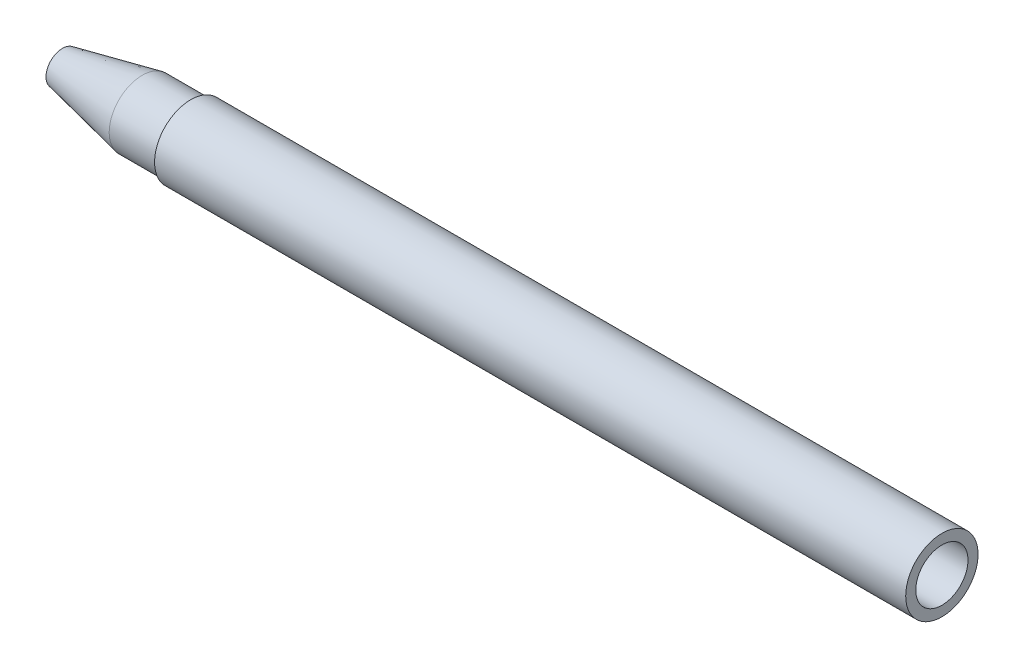
ISO-10303-21;
HEADER;
FILE_DESCRIPTION(('STEP AP214'),'2;1');
FILE_NAME('part.step','',(''),(''),'','','');
FILE_SCHEMA(('AUTOMOTIVE_DESIGN { 1 0 10303 214 1 1 1 1 }'));
ENDSEC;
DATA;
#1=APPLICATION_CONTEXT('core data for automotive mechanical design processes');
#2=APPLICATION_PROTOCOL_DEFINITION('international standard','automotive_design',2000,#1);
#3=PRODUCT_CONTEXT('',#1,'mechanical');
#4=PRODUCT('Part','Part','',(#3));
#5=PRODUCT_RELATED_PRODUCT_CATEGORY('part','',(#4));
#6=PRODUCT_DEFINITION_FORMATION('','',#4);
#7=PRODUCT_DEFINITION_CONTEXT('part definition',#1,'design');
#8=PRODUCT_DEFINITION('design','',#6,#7);
#9=PRODUCT_DEFINITION_SHAPE('','',#8);
#10=(LENGTH_UNIT() NAMED_UNIT(*) SI_UNIT(.MILLI.,.METRE.));
#11=(NAMED_UNIT(*) PLANE_ANGLE_UNIT() SI_UNIT($,.RADIAN.));
#12=(NAMED_UNIT(*) SI_UNIT($,.STERADIAN.) SOLID_ANGLE_UNIT());
#13=UNCERTAINTY_MEASURE_WITH_UNIT(LENGTH_MEASURE(1.E-05),#10,'distance_accuracy_value','');
#14=(GEOMETRIC_REPRESENTATION_CONTEXT(3) GLOBAL_UNCERTAINTY_ASSIGNED_CONTEXT((#13)) GLOBAL_UNIT_ASSIGNED_CONTEXT((#10,
#11,#12)) REPRESENTATION_CONTEXT('',''));
#15=CARTESIAN_POINT('',(0.,0.,0.));
#16=DIRECTION('',(0.,0.,1.));
#17=DIRECTION('',(1.,0.,0.));
#18=AXIS2_PLACEMENT_3D('',#15,#16,#17);
#19=CARTESIAN_POINT('',(51.9,0.,0.));
#20=DIRECTION('',(-1.,0.,0.));
#21=DIRECTION('',(0.,0.,1.));
#22=AXIS2_PLACEMENT_3D('',#19,#20,#21);
#23=PLANE('',#22);
#24=CARTESIAN_POINT('',(51.9000000000001,-5.,0.));
#25=DIRECTION('',(-1.,0.,0.));
#26=DIRECTION('',(0.,0.,1.));
#27=AXIS2_PLACEMENT_3D('',#24,#25,#26);
#28=CIRCLE('',#27,5.00000000000002);
#29=CARTESIAN_POINT('',(51.9000000000001,-5.,5.00000000000002));
#30=VERTEX_POINT('',#29);
#31=EDGE_CURVE('E58',#30,#30,#28,.T.);
#32=ORIENTED_EDGE('',*,*,#31,.F.);
#33=EDGE_LOOP('',(#32));
#34=FACE_BOUND('',#33,.T.);
#35=CARTESIAN_POINT('',(51.9,-5.,0.));
#36=DIRECTION('',(-1.,0.,0.));
#37=DIRECTION('',(0.,0.,1.));
#38=AXIS2_PLACEMENT_3D('',#35,#36,#37);
#39=CIRCLE('',#38,3.61000000000002);
#40=CARTESIAN_POINT('',(51.9,-5.,3.61000000000002));
#41=VERTEX_POINT('',#40);
#42=EDGE_CURVE('E10',#41,#41,#39,.T.);
#43=ORIENTED_EDGE('',*,*,#42,.T.);
#44=EDGE_LOOP('',(#43));
#45=FACE_BOUND('',#44,.T.);
#46=ADVANCED_FACE('F30',(#34,#45),#23,.F.);
#47=CARTESIAN_POINT('',(-81.2360981724549,-5.,0.));
#48=DIRECTION('',(-1.,0.,0.));
#49=DIRECTION('',(0.,0.,1.));
#50=AXIS2_PLACEMENT_3D('',#47,#48,#49);
#51=CYLINDRICAL_SURFACE('',#50,3.61000000000002);
#52=ORIENTED_EDGE('',*,*,#42,.F.);
#53=EDGE_LOOP('',(#52));
#54=FACE_BOUND('',#53,.T.);
#55=CARTESIAN_POINT('',(-58.6,-5.,0.));
#56=DIRECTION('',(-1.,0.,0.));
#57=DIRECTION('',(0.,0.,1.));
#58=AXIS2_PLACEMENT_3D('',#55,#56,#57);
#59=CIRCLE('',#58,3.61000000000002);
#60=CARTESIAN_POINT('',(-58.6,-5.,3.61000000000002));
#61=VERTEX_POINT('',#60);
#62=EDGE_CURVE('E36',#61,#61,#59,.T.);
#63=ORIENTED_EDGE('',*,*,#62,.T.);
#64=EDGE_LOOP('',(#63));
#65=FACE_BOUND('',#64,.T.);
#66=ADVANCED_FACE('F65',(#54,#65),#51,.F.);
#67=CARTESIAN_POINT('',(-69.6300000000001,-5.,0.));
#68=DIRECTION('',(1.,0.,0.));
#69=DIRECTION('',(0.,0.,-1.));
#70=AXIS2_PLACEMENT_3D('',#67,#68,#69);
#71=CONICAL_SURFACE('',#70,1.30999999999999,0.205576404320656);
#72=ORIENTED_EDGE('',*,*,#62,.F.);
#73=EDGE_LOOP('',(#72));
#74=FACE_BOUND('',#73,.T.);
#75=CARTESIAN_POINT('',(-69.6300000000001,-5.,0.));
#76=DIRECTION('',(-1.,0.,0.));
#77=DIRECTION('',(0.,0.,1.));
#78=AXIS2_PLACEMENT_3D('',#75,#76,#77);
#79=CIRCLE('',#78,1.30999999999999);
#80=CARTESIAN_POINT('',(-69.6300000000001,-5.,1.30999999999999));
#81=VERTEX_POINT('',#80);
#82=EDGE_CURVE('E40',#81,#81,#79,.T.);
#83=ORIENTED_EDGE('',*,*,#82,.T.);
#84=EDGE_LOOP('',(#83));
#85=FACE_BOUND('',#84,.T.);
#86=ADVANCED_FACE('F69',(#74,#85),#71,.F.);
#87=CARTESIAN_POINT('',(-69.6300000000001,-3.69000000000001,0.));
#88=DIRECTION('',(1.,0.,0.));
#89=DIRECTION('',(0.,0.,-1.));
#90=AXIS2_PLACEMENT_3D('',#87,#88,#89);
#91=PLANE('',#90);
#92=ORIENTED_EDGE('',*,*,#82,.F.);
#93=EDGE_LOOP('',(#92));
#94=FACE_BOUND('',#93,.T.);
#95=CARTESIAN_POINT('',(-69.6300000000001,-5.,0.));
#96=DIRECTION('',(-1.,0.,0.));
#97=DIRECTION('',(0.,0.,1.));
#98=AXIS2_PLACEMENT_3D('',#95,#96,#97);
#99=CIRCLE('',#98,2.27);
#100=CARTESIAN_POINT('',(-69.6300000000001,-5.,2.27));
#101=VERTEX_POINT('',#100);
#102=EDGE_CURVE('E44',#101,#101,#99,.T.);
#103=ORIENTED_EDGE('',*,*,#102,.T.);
#104=EDGE_LOOP('',(#103));
#105=FACE_BOUND('',#104,.T.);
#106=ADVANCED_FACE('F74',(#94,#105),#91,.F.);
#107=CARTESIAN_POINT('',(-58.6,-5.,0.));
#108=DIRECTION('',(1.,0.,0.));
#109=DIRECTION('',(0.,0.,-1.));
#110=AXIS2_PLACEMENT_3D('',#107,#108,#109);
#111=CONICAL_SURFACE('',#110,4.57,0.205576404320654);
#112=ORIENTED_EDGE('',*,*,#102,.F.);
#113=EDGE_LOOP('',(#112));
#114=FACE_BOUND('',#113,.T.);
#115=CARTESIAN_POINT('',(-58.6,-5.,0.));
#116=DIRECTION('',(-1.,0.,0.));
#117=DIRECTION('',(0.,0.,1.));
#118=AXIS2_PLACEMENT_3D('',#115,#116,#117);
#119=CIRCLE('',#118,4.57);
#120=CARTESIAN_POINT('',(-58.6,-5.,4.57));
#121=VERTEX_POINT('',#120);
#122=EDGE_CURVE('E49',#121,#121,#119,.T.);
#123=ORIENTED_EDGE('',*,*,#122,.T.);
#124=EDGE_LOOP('',(#123));
#125=FACE_BOUND('',#124,.T.);
#126=ADVANCED_FACE('F80',(#114,#125),#111,.T.);
#127=CARTESIAN_POINT('',(-81.2360981724549,-5.,0.));
#128=DIRECTION('',(-1.,0.,0.));
#129=DIRECTION('',(0.,0.,1.));
#130=AXIS2_PLACEMENT_3D('',#127,#128,#129);
#131=CYLINDRICAL_SURFACE('',#130,4.57);
#132=ORIENTED_EDGE('',*,*,#122,.F.);
#133=EDGE_LOOP('',(#132));
#134=FACE_BOUND('',#133,.T.);
#135=CARTESIAN_POINT('',(-51.9000000000001,-5.,0.));
#136=DIRECTION('',(-1.,0.,0.));
#137=DIRECTION('',(0.,0.,1.));
#138=AXIS2_PLACEMENT_3D('',#135,#136,#137);
#139=CIRCLE('',#138,4.57);
#140=CARTESIAN_POINT('',(-51.9000000000001,-5.,4.57));
#141=VERTEX_POINT('',#140);
#142=EDGE_CURVE('E52',#141,#141,#139,.T.);
#143=ORIENTED_EDGE('',*,*,#142,.T.);
#144=EDGE_LOOP('',(#143));
#145=FACE_BOUND('',#144,.T.);
#146=ADVANCED_FACE('F84',(#134,#145),#131,.T.);
#147=CARTESIAN_POINT('',(-51.9000000000001,0.,0.));
#148=DIRECTION('',(1.,0.,0.));
#149=DIRECTION('',(0.,0.,-1.));
#150=AXIS2_PLACEMENT_3D('',#147,#148,#149);
#151=PLANE('',#150);
#152=ORIENTED_EDGE('',*,*,#142,.F.);
#153=EDGE_LOOP('',(#152));
#154=FACE_BOUND('',#153,.T.);
#155=CARTESIAN_POINT('',(-51.9000000000001,-5.,0.));
#156=DIRECTION('',(-1.,0.,0.));
#157=DIRECTION('',(0.,0.,1.));
#158=AXIS2_PLACEMENT_3D('',#155,#156,#157);
#159=CIRCLE('',#158,5.);
#160=CARTESIAN_POINT('',(-51.9000000000001,-5.,5.));
#161=VERTEX_POINT('',#160);
#162=EDGE_CURVE('E55',#161,#161,#159,.T.);
#163=ORIENTED_EDGE('',*,*,#162,.T.);
#164=EDGE_LOOP('',(#163));
#165=FACE_BOUND('',#164,.T.);
#166=ADVANCED_FACE('F88',(#154,#165),#151,.F.);
#167=CARTESIAN_POINT('',(-81.2360981724549,-5.,0.));
#168=DIRECTION('',(-1.,0.,0.));
#169=DIRECTION('',(0.,0.,1.));
#170=AXIS2_PLACEMENT_3D('',#167,#168,#169);
#171=CYLINDRICAL_SURFACE('',#170,5.00000000000001);
#172=ORIENTED_EDGE('',*,*,#162,.F.);
#173=EDGE_LOOP('',(#172));
#174=FACE_BOUND('',#173,.T.);
#175=ORIENTED_EDGE('',*,*,#31,.T.);
#176=EDGE_LOOP('',(#175));
#177=FACE_BOUND('',#176,.T.);
#178=ADVANCED_FACE('F62',(#174,#177),#171,.T.);
#179=CLOSED_SHELL('',(#46,#66,#86,#106,#126,#146,#166,#178));
#180=MANIFOLD_SOLID_BREP('B2',#179);
#181=ADVANCED_BREP_SHAPE_REPRESENTATION('',(#18,#180),#14);
#182=SHAPE_DEFINITION_REPRESENTATION(#9,#181);
ENDSEC;
END-ISO-10303-21;
